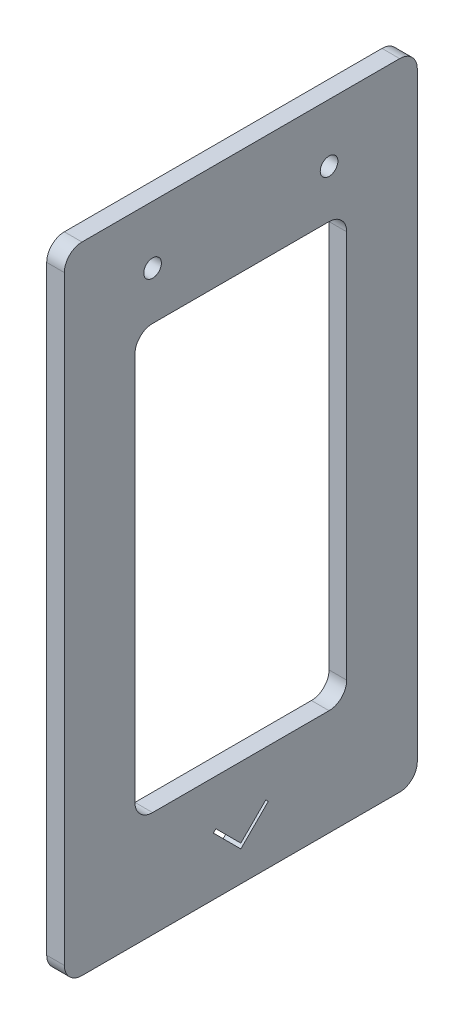
ISO-10303-21;
HEADER;
FILE_DESCRIPTION(('STEP AP214'),'2;1');
FILE_NAME('part.step','',(''),(''),'','','');
FILE_SCHEMA(('AUTOMOTIVE_DESIGN { 1 0 10303 214 1 1 1 1 }'));
ENDSEC;
DATA;
#1=APPLICATION_CONTEXT('core data for automotive mechanical design processes');
#2=APPLICATION_PROTOCOL_DEFINITION('international standard','automotive_design',2000,#1);
#3=PRODUCT_CONTEXT('',#1,'mechanical');
#4=PRODUCT('Part','Part','',(#3));
#5=PRODUCT_RELATED_PRODUCT_CATEGORY('part','',(#4));
#6=PRODUCT_DEFINITION_FORMATION('','',#4);
#7=PRODUCT_DEFINITION_CONTEXT('part definition',#1,'design');
#8=PRODUCT_DEFINITION('design','',#6,#7);
#9=PRODUCT_DEFINITION_SHAPE('','',#8);
#10=(LENGTH_UNIT() NAMED_UNIT(*) SI_UNIT(.MILLI.,.METRE.));
#11=(NAMED_UNIT(*) PLANE_ANGLE_UNIT() SI_UNIT($,.RADIAN.));
#12=(NAMED_UNIT(*) SI_UNIT($,.STERADIAN.) SOLID_ANGLE_UNIT());
#13=UNCERTAINTY_MEASURE_WITH_UNIT(LENGTH_MEASURE(1.E-05),#10,'distance_accuracy_value','');
#14=(GEOMETRIC_REPRESENTATION_CONTEXT(3) GLOBAL_UNCERTAINTY_ASSIGNED_CONTEXT((#13)) GLOBAL_UNIT_ASSIGNED_CONTEXT((#10,
#11,#12)) REPRESENTATION_CONTEXT('',''));
#15=CARTESIAN_POINT('',(0.,0.,0.));
#16=DIRECTION('',(0.,0.,1.));
#17=DIRECTION('',(1.,0.,0.));
#18=AXIS2_PLACEMENT_3D('',#15,#16,#17);
#19=CARTESIAN_POINT('',(6.35,-107.95,57.15));
#20=DIRECTION('',(-1.,0.,0.));
#21=DIRECTION('',(0.,0.,1.));
#22=AXIS2_PLACEMENT_3D('',#19,#20,#21);
#23=PLANE('',#22);
#24=CARTESIAN_POINT('',(6.35,93.472,31.75));
#25=DIRECTION('',(-1.,0.,0.));
#26=DIRECTION('',(0.,0.,1.));
#27=AXIS2_PLACEMENT_3D('',#24,#25,#26);
#28=CIRCLE('',#27,3.175);
#29=CARTESIAN_POINT('',(6.35,93.472,34.925));
#30=VERTEX_POINT('',#29);
#31=EDGE_CURVE('E651',#30,#30,#28,.T.);
#32=ORIENTED_EDGE('',*,*,#31,.T.);
#33=EDGE_LOOP('',(#32));
#34=FACE_BOUND('',#33,.T.);
#35=CARTESIAN_POINT('',(6.35,93.472,-31.75));
#36=DIRECTION('',(-1.,0.,0.));
#37=DIRECTION('',(0.,0.,1.));
#38=AXIS2_PLACEMENT_3D('',#35,#36,#37);
#39=CIRCLE('',#38,3.175);
#40=CARTESIAN_POINT('',(6.35,93.472,-28.575));
#41=VERTEX_POINT('',#40);
#42=EDGE_CURVE('E654',#41,#41,#39,.T.);
#43=ORIENTED_EDGE('',*,*,#42,.T.);
#44=EDGE_LOOP('',(#43));
#45=FACE_BOUND('',#44,.T.);
#46=DIRECTION('',(0.,0.707106781186545,0.70710678118655));
#47=VECTOR('',#46,1.);
#48=CARTESIAN_POINT('',(6.35,-101.6,0.));
#49=LINE('',#48,#47);
#50=CARTESIAN_POINT('',(6.35,-101.6,0.));
#51=VERTEX_POINT('',#50);
#52=CARTESIAN_POINT('',(6.35,-92.6197438789309,8.98025612106918));
#53=VERTEX_POINT('',#52);
#54=EDGE_CURVE('E214',#51,#53,#49,.T.);
#55=ORIENTED_EDGE('',*,*,#54,.F.);
#56=DIRECTION('',(0.,-0.707106781186547,0.707106781186548));
#57=VECTOR('',#56,1.);
#58=CARTESIAN_POINT('',(6.35,-101.6,0.));
#59=LINE('',#58,#57);
#60=CARTESIAN_POINT('',(6.35,-92.6197438789308,-8.98025612106915));
#61=VERTEX_POINT('',#60);
#62=EDGE_CURVE('E55',#61,#51,#59,.T.);
#63=ORIENTED_EDGE('',*,*,#62,.F.);
#64=DIRECTION('',(0.,0.707106781186549,0.707106781186546));
#65=VECTOR('',#64,1.);
#66=CARTESIAN_POINT('',(6.35,-92.6197438789308,-8.98025612106915));
#67=LINE('',#66,#65);
#68=CARTESIAN_POINT('',(6.35,-93.5177694910378,-9.87828173317608));
#69=VERTEX_POINT('',#68);
#70=EDGE_CURVE('E203',#69,#61,#67,.T.);
#71=ORIENTED_EDGE('',*,*,#70,.F.);
#72=DIRECTION('',(0.,0.707106781186549,-0.707106781186546));
#73=VECTOR('',#72,1.);
#74=CARTESIAN_POINT('',(6.35,-103.396051224214,0.));
#75=LINE('',#74,#73);
#76=CARTESIAN_POINT('',(6.35,-103.396051224214,0.));
#77=VERTEX_POINT('',#76);
#78=EDGE_CURVE('E230',#77,#69,#75,.T.);
#79=ORIENTED_EDGE('',*,*,#78,.F.);
#80=DIRECTION('',(0.,-0.707106781186547,-0.707106781186548));
#81=VECTOR('',#80,1.);
#82=CARTESIAN_POINT('',(6.35,-93.5177694910378,9.87828173317609));
#83=LINE('',#82,#81);
#84=CARTESIAN_POINT('',(6.35,-93.5177694910378,9.87828173317609));
#85=VERTEX_POINT('',#84);
#86=EDGE_CURVE('E226',#85,#77,#83,.T.);
#87=ORIENTED_EDGE('',*,*,#86,.F.);
#88=DIRECTION('',(0.,-0.707106781186557,0.707106781186538));
#89=VECTOR('',#88,1.);
#90=CARTESIAN_POINT('',(6.35,-92.6197438789309,8.98025612106918));
#91=LINE('',#90,#89);
#92=EDGE_CURVE('E222',#53,#85,#91,.T.);
#93=ORIENTED_EDGE('',*,*,#92,.F.);
#94=EDGE_LOOP('',(#55,#63,#71,#79,#87,#93));
#95=FACE_BOUND('',#94,.T.);
#96=CARTESIAN_POINT('',(6.35,-107.95,57.15));
#97=DIRECTION('',(1.,0.,0.));
#98=DIRECTION('',(0.,0.,1.));
#99=AXIS2_PLACEMENT_3D('',#96,#97,#98);
#100=CIRCLE('',#99,6.35);
#101=CARTESIAN_POINT('',(6.35,-107.95,63.5));
#102=VERTEX_POINT('',#101);
#103=CARTESIAN_POINT('',(6.35,-114.3,57.15));
#104=VERTEX_POINT('',#103);
#105=EDGE_CURVE('E333',#102,#104,#100,.T.);
#106=ORIENTED_EDGE('',*,*,#105,.T.);
#107=DIRECTION('',(0.,0.,-1.));
#108=VECTOR('',#107,1.);
#109=CARTESIAN_POINT('',(6.35,-114.3,57.15));
#110=LINE('',#109,#108);
#111=CARTESIAN_POINT('',(6.35,-114.3,-57.15));
#112=VERTEX_POINT('',#111);
#113=EDGE_CURVE('E337',#104,#112,#110,.T.);
#114=ORIENTED_EDGE('',*,*,#113,.T.);
#115=CARTESIAN_POINT('',(6.35,-107.95,-57.15));
#116=DIRECTION('',(1.,0.,0.));
#117=DIRECTION('',(0.,0.,1.));
#118=AXIS2_PLACEMENT_3D('',#115,#116,#117);
#119=CIRCLE('',#118,6.35);
#120=CARTESIAN_POINT('',(6.35,-107.95,-63.5));
#121=VERTEX_POINT('',#120);
#122=EDGE_CURVE('E341',#112,#121,#119,.T.);
#123=ORIENTED_EDGE('',*,*,#122,.T.);
#124=DIRECTION('',(0.,1.,0.));
#125=VECTOR('',#124,1.);
#126=CARTESIAN_POINT('',(6.35,-107.95,-63.5));
#127=LINE('',#126,#125);
#128=CARTESIAN_POINT('',(6.35,107.95,-63.5));
#129=VERTEX_POINT('',#128);
#130=EDGE_CURVE('E344',#121,#129,#127,.T.);
#131=ORIENTED_EDGE('',*,*,#130,.T.);
#132=CARTESIAN_POINT('',(6.35,107.95,-57.15));
#133=DIRECTION('',(1.,0.,0.));
#134=DIRECTION('',(0.,0.,-1.));
#135=AXIS2_PLACEMENT_3D('',#132,#133,#134);
#136=CIRCLE('',#135,6.35);
#137=CARTESIAN_POINT('',(6.35,114.3,-57.15));
#138=VERTEX_POINT('',#137);
#139=EDGE_CURVE('E347',#129,#138,#136,.T.);
#140=ORIENTED_EDGE('',*,*,#139,.T.);
#141=DIRECTION('',(0.,0.,1.));
#142=VECTOR('',#141,1.);
#143=CARTESIAN_POINT('',(6.35,114.3,57.15));
#144=LINE('',#143,#142);
#145=CARTESIAN_POINT('',(6.35,114.3,57.15));
#146=VERTEX_POINT('',#145);
#147=EDGE_CURVE('E350',#138,#146,#144,.T.);
#148=ORIENTED_EDGE('',*,*,#147,.T.);
#149=CARTESIAN_POINT('',(6.35,107.95,57.15));
#150=DIRECTION('',(1.,0.,0.));
#151=DIRECTION('',(0.,0.,1.));
#152=AXIS2_PLACEMENT_3D('',#149,#150,#151);
#153=CIRCLE('',#152,6.35);
#154=CARTESIAN_POINT('',(6.35,107.95,63.5));
#155=VERTEX_POINT('',#154);
#156=EDGE_CURVE('E353',#146,#155,#153,.T.);
#157=ORIENTED_EDGE('',*,*,#156,.T.);
#158=DIRECTION('',(0.,-1.,0.));
#159=VECTOR('',#158,1.);
#160=CARTESIAN_POINT('',(6.35,-107.95,63.5));
#161=LINE('',#160,#159);
#162=EDGE_CURVE('E356',#155,#102,#161,.T.);
#163=ORIENTED_EDGE('',*,*,#162,.T.);
#164=EDGE_LOOP('',(#106,#114,#123,#131,#140,#148,#157,#163));
#165=FACE_BOUND('',#164,.T.);
#166=CARTESIAN_POINT('',(6.35,-69.85,-31.75));
#167=DIRECTION('',(1.,0.,0.));
#168=DIRECTION('',(0.,0.,-1.));
#169=AXIS2_PLACEMENT_3D('',#166,#167,#168);
#170=CIRCLE('',#169,6.34999999999999);
#171=CARTESIAN_POINT('',(6.35,-76.2,-31.75));
#172=VERTEX_POINT('',#171);
#173=CARTESIAN_POINT('',(6.35,-69.85,-38.1));
#174=VERTEX_POINT('',#173);
#175=EDGE_CURVE('E250',#172,#174,#170,.T.);
#176=ORIENTED_EDGE('',*,*,#175,.F.);
#177=DIRECTION('',(0.,0.,-1.));
#178=VECTOR('',#177,1.);
#179=CARTESIAN_POINT('',(6.35,-76.2,31.75));
#180=LINE('',#179,#178);
#181=CARTESIAN_POINT('',(6.35,-76.2,31.75));
#182=VERTEX_POINT('',#181);
#183=EDGE_CURVE('E273',#182,#172,#180,.T.);
#184=ORIENTED_EDGE('',*,*,#183,.F.);
#185=CARTESIAN_POINT('',(6.35,-69.85,31.75));
#186=DIRECTION('',(1.,0.,0.));
#187=DIRECTION('',(0.,0.,1.));
#188=AXIS2_PLACEMENT_3D('',#185,#186,#187);
#189=CIRCLE('',#188,6.35);
#190=CARTESIAN_POINT('',(6.35,-69.85,38.1));
#191=VERTEX_POINT('',#190);
#192=EDGE_CURVE('E269',#191,#182,#189,.T.);
#193=ORIENTED_EDGE('',*,*,#192,.F.);
#194=DIRECTION('',(0.,-1.,0.));
#195=VECTOR('',#194,1.);
#196=CARTESIAN_POINT('',(6.35,-69.85,38.1));
#197=LINE('',#196,#195);
#198=CARTESIAN_POINT('',(6.35,69.85,38.1));
#199=VERTEX_POINT('',#198);
#200=EDGE_CURVE('E266',#199,#191,#197,.T.);
#201=ORIENTED_EDGE('',*,*,#200,.F.);
#202=CARTESIAN_POINT('',(6.35,69.85,31.75));
#203=DIRECTION('',(1.,0.,0.));
#204=DIRECTION('',(0.,0.,1.));
#205=AXIS2_PLACEMENT_3D('',#202,#203,#204);
#206=CIRCLE('',#205,6.35);
#207=CARTESIAN_POINT('',(6.35,76.2,31.75));
#208=VERTEX_POINT('',#207);
#209=EDGE_CURVE('E263',#208,#199,#206,.T.);
#210=ORIENTED_EDGE('',*,*,#209,.F.);
#211=DIRECTION('',(0.,0.,1.));
#212=VECTOR('',#211,1.);
#213=CARTESIAN_POINT('',(6.35,76.2,31.75));
#214=LINE('',#213,#212);
#215=CARTESIAN_POINT('',(6.35,76.2,-31.75));
#216=VERTEX_POINT('',#215);
#217=EDGE_CURVE('E260',#216,#208,#214,.T.);
#218=ORIENTED_EDGE('',*,*,#217,.F.);
#219=CARTESIAN_POINT('',(6.35,69.85,-31.75));
#220=DIRECTION('',(1.,0.,0.));
#221=DIRECTION('',(0.,0.,1.));
#222=AXIS2_PLACEMENT_3D('',#219,#220,#221);
#223=CIRCLE('',#222,6.35);
#224=CARTESIAN_POINT('',(6.35,69.85,-38.1));
#225=VERTEX_POINT('',#224);
#226=EDGE_CURVE('E257',#225,#216,#223,.T.);
#227=ORIENTED_EDGE('',*,*,#226,.F.);
#228=DIRECTION('',(0.,1.,0.));
#229=VECTOR('',#228,1.);
#230=CARTESIAN_POINT('',(6.35,-69.85,-38.1));
#231=LINE('',#230,#229);
#232=EDGE_CURVE('E253',#174,#225,#231,.T.);
#233=ORIENTED_EDGE('',*,*,#232,.F.);
#234=EDGE_LOOP('',(#176,#184,#193,#201,#210,#218,#227,#233));
#235=FACE_BOUND('',#234,.T.);
#236=ADVANCED_FACE('F39',(#34,#45,#95,#165,#235),#23,.F.);
#237=CARTESIAN_POINT('',(0.,-107.95,57.15));
#238=DIRECTION('',(-1.,0.,0.));
#239=DIRECTION('',(0.,0.,1.));
#240=AXIS2_PLACEMENT_3D('',#237,#238,#239);
#241=PLANE('',#240);
#242=CARTESIAN_POINT('',(0.,93.472,31.75));
#243=DIRECTION('',(1.,0.,0.));
#244=DIRECTION('',(0.,0.,-1.));
#245=AXIS2_PLACEMENT_3D('',#242,#243,#244);
#246=CIRCLE('',#245,3.175);
#247=CARTESIAN_POINT('',(0.,93.472,28.575));
#248=VERTEX_POINT('',#247);
#249=EDGE_CURVE('E649',#248,#248,#246,.T.);
#250=ORIENTED_EDGE('',*,*,#249,.T.);
#251=EDGE_LOOP('',(#250));
#252=FACE_BOUND('',#251,.T.);
#253=CARTESIAN_POINT('',(0.,93.472,-31.75));
#254=DIRECTION('',(1.,0.,0.));
#255=DIRECTION('',(0.,0.,-1.));
#256=AXIS2_PLACEMENT_3D('',#253,#254,#255);
#257=CIRCLE('',#256,3.175);
#258=CARTESIAN_POINT('',(0.,93.472,-34.925));
#259=VERTEX_POINT('',#258);
#260=EDGE_CURVE('E675',#259,#259,#257,.T.);
#261=ORIENTED_EDGE('',*,*,#260,.T.);
#262=EDGE_LOOP('',(#261));
#263=FACE_BOUND('',#262,.T.);
#264=DIRECTION('',(0.,-0.707106781186547,0.707106781186548));
#265=VECTOR('',#264,1.);
#266=CARTESIAN_POINT('',(0.,-101.6,0.));
#267=LINE('',#266,#265);
#268=CARTESIAN_POINT('',(0.,-92.6197438789308,-8.98025612106915));
#269=VERTEX_POINT('',#268);
#270=CARTESIAN_POINT('',(0.,-101.6,0.));
#271=VERTEX_POINT('',#270);
#272=EDGE_CURVE('E200',#269,#271,#267,.T.);
#273=ORIENTED_EDGE('',*,*,#272,.T.);
#274=DIRECTION('',(0.,0.707106781186545,0.70710678118655));
#275=VECTOR('',#274,1.);
#276=CARTESIAN_POINT('',(0.,-101.6,0.));
#277=LINE('',#276,#275);
#278=CARTESIAN_POINT('',(0.,-92.6197438789309,8.98025612106917));
#279=VERTEX_POINT('',#278);
#280=EDGE_CURVE('E188',#271,#279,#277,.T.);
#281=ORIENTED_EDGE('',*,*,#280,.T.);
#282=DIRECTION('',(0.,-0.707106781186557,0.707106781186538));
#283=VECTOR('',#282,1.);
#284=CARTESIAN_POINT('',(0.,-92.6197438789309,8.98025612106918));
#285=LINE('',#284,#283);
#286=CARTESIAN_POINT('',(0.,-93.5177694910378,9.87828173317609));
#287=VERTEX_POINT('',#286);
#288=EDGE_CURVE('E653',#279,#287,#285,.T.);
#289=ORIENTED_EDGE('',*,*,#288,.T.);
#290=DIRECTION('',(0.,-0.707106781186547,-0.707106781186548));
#291=VECTOR('',#290,1.);
#292=CARTESIAN_POINT('',(0.,-93.5177694910378,9.87828173317609));
#293=LINE('',#292,#291);
#294=CARTESIAN_POINT('',(0.,-103.396051224214,0.));
#295=VERTEX_POINT('',#294);
#296=EDGE_CURVE('E658',#287,#295,#293,.T.);
#297=ORIENTED_EDGE('',*,*,#296,.T.);
#298=DIRECTION('',(0.,0.707106781186549,-0.707106781186546));
#299=VECTOR('',#298,1.);
#300=CARTESIAN_POINT('',(0.,-103.396051224214,0.));
#301=LINE('',#300,#299);
#302=CARTESIAN_POINT('',(0.,-93.5177694910378,-9.87828173317608));
#303=VERTEX_POINT('',#302);
#304=EDGE_CURVE('E216',#295,#303,#301,.T.);
#305=ORIENTED_EDGE('',*,*,#304,.T.);
#306=DIRECTION('',(0.,0.707106781186549,0.707106781186546));
#307=VECTOR('',#306,1.);
#308=CARTESIAN_POINT('',(0.,-92.6197438789308,-8.98025612106915));
#309=LINE('',#308,#307);
#310=EDGE_CURVE('E209',#303,#269,#309,.T.);
#311=ORIENTED_EDGE('',*,*,#310,.T.);
#312=EDGE_LOOP('',(#273,#281,#289,#297,#305,#311));
#313=FACE_BOUND('',#312,.T.);
#314=CARTESIAN_POINT('',(0.,-107.95,57.15));
#315=DIRECTION('',(1.,0.,0.));
#316=DIRECTION('',(0.,0.,1.));
#317=AXIS2_PLACEMENT_3D('',#314,#315,#316);
#318=CIRCLE('',#317,6.35);
#319=CARTESIAN_POINT('',(0.,-107.95,63.5));
#320=VERTEX_POINT('',#319);
#321=CARTESIAN_POINT('',(0.,-114.3,57.15));
#322=VERTEX_POINT('',#321);
#323=EDGE_CURVE('E332',#320,#322,#318,.T.);
#324=ORIENTED_EDGE('',*,*,#323,.F.);
#325=DIRECTION('',(0.,-1.,0.));
#326=VECTOR('',#325,1.);
#327=CARTESIAN_POINT('',(0.,-107.95,63.5));
#328=LINE('',#327,#326);
#329=CARTESIAN_POINT('',(0.,107.95,63.5));
#330=VERTEX_POINT('',#329);
#331=EDGE_CURVE('E338',#330,#320,#328,.T.);
#332=ORIENTED_EDGE('',*,*,#331,.F.);
#333=CARTESIAN_POINT('',(0.,107.95,57.15));
#334=DIRECTION('',(1.,0.,0.));
#335=DIRECTION('',(0.,0.,1.));
#336=AXIS2_PLACEMENT_3D('',#333,#334,#335);
#337=CIRCLE('',#336,6.35);
#338=CARTESIAN_POINT('',(0.,114.3,57.15));
#339=VERTEX_POINT('',#338);
#340=EDGE_CURVE('E378',#339,#330,#337,.T.);
#341=ORIENTED_EDGE('',*,*,#340,.F.);
#342=DIRECTION('',(0.,0.,1.));
#343=VECTOR('',#342,1.);
#344=CARTESIAN_POINT('',(0.,114.3,57.15));
#345=LINE('',#344,#343);
#346=CARTESIAN_POINT('',(0.,114.3,-57.15));
#347=VERTEX_POINT('',#346);
#348=EDGE_CURVE('E375',#347,#339,#345,.T.);
#349=ORIENTED_EDGE('',*,*,#348,.F.);
#350=CARTESIAN_POINT('',(0.,107.95,-57.15));
#351=DIRECTION('',(1.,0.,0.));
#352=DIRECTION('',(0.,0.,-1.));
#353=AXIS2_PLACEMENT_3D('',#350,#351,#352);
#354=CIRCLE('',#353,6.35);
#355=CARTESIAN_POINT('',(0.,107.95,-63.5));
#356=VERTEX_POINT('',#355);
#357=EDGE_CURVE('E372',#356,#347,#354,.T.);
#358=ORIENTED_EDGE('',*,*,#357,.F.);
#359=DIRECTION('',(0.,1.,0.));
#360=VECTOR('',#359,1.);
#361=CARTESIAN_POINT('',(0.,-107.95,-63.5));
#362=LINE('',#361,#360);
#363=CARTESIAN_POINT('',(0.,-107.95,-63.5));
#364=VERTEX_POINT('',#363);
#365=EDGE_CURVE('E369',#364,#356,#362,.T.);
#366=ORIENTED_EDGE('',*,*,#365,.F.);
#367=CARTESIAN_POINT('',(0.,-107.95,-57.15));
#368=DIRECTION('',(1.,0.,0.));
#369=DIRECTION('',(0.,0.,1.));
#370=AXIS2_PLACEMENT_3D('',#367,#368,#369);
#371=CIRCLE('',#370,6.35);
#372=CARTESIAN_POINT('',(0.,-114.3,-57.15));
#373=VERTEX_POINT('',#372);
#374=EDGE_CURVE('E366',#373,#364,#371,.T.);
#375=ORIENTED_EDGE('',*,*,#374,.F.);
#376=DIRECTION('',(0.,0.,-1.));
#377=VECTOR('',#376,1.);
#378=CARTESIAN_POINT('',(0.,-114.3,57.15));
#379=LINE('',#378,#377);
#380=EDGE_CURVE('E363',#322,#373,#379,.T.);
#381=ORIENTED_EDGE('',*,*,#380,.F.);
#382=EDGE_LOOP('',(#324,#332,#341,#349,#358,#366,#375,#381));
#383=FACE_BOUND('',#382,.T.);
#384=DIRECTION('',(0.,0.,-1.));
#385=VECTOR('',#384,1.);
#386=CARTESIAN_POINT('',(0.,-76.2,31.75));
#387=LINE('',#386,#385);
#388=CARTESIAN_POINT('',(0.,-76.2,31.75));
#389=VERTEX_POINT('',#388);
#390=CARTESIAN_POINT('',(0.,-76.2,-31.75));
#391=VERTEX_POINT('',#390);
#392=EDGE_CURVE('E254',#389,#391,#387,.T.);
#393=ORIENTED_EDGE('',*,*,#392,.T.);
#394=CARTESIAN_POINT('',(0.,-69.85,-31.75));
#395=DIRECTION('',(1.,0.,0.));
#396=DIRECTION('',(0.,0.,-1.));
#397=AXIS2_PLACEMENT_3D('',#394,#395,#396);
#398=CIRCLE('',#397,6.34999999999999);
#399=CARTESIAN_POINT('',(0.,-69.85,-38.1));
#400=VERTEX_POINT('',#399);
#401=EDGE_CURVE('E196',#391,#400,#398,.T.);
#402=ORIENTED_EDGE('',*,*,#401,.T.);
#403=DIRECTION('',(0.,1.,0.));
#404=VECTOR('',#403,1.);
#405=CARTESIAN_POINT('',(0.,-69.85,-38.1));
#406=LINE('',#405,#404);
#407=CARTESIAN_POINT('',(0.,69.85,-38.1));
#408=VERTEX_POINT('',#407);
#409=EDGE_CURVE('E280',#400,#408,#406,.T.);
#410=ORIENTED_EDGE('',*,*,#409,.T.);
#411=CARTESIAN_POINT('',(0.,69.85,-31.75));
#412=DIRECTION('',(1.,0.,0.));
#413=DIRECTION('',(0.,0.,1.));
#414=AXIS2_PLACEMENT_3D('',#411,#412,#413);
#415=CIRCLE('',#414,6.35);
#416=CARTESIAN_POINT('',(0.,76.2,-31.75));
#417=VERTEX_POINT('',#416);
#418=EDGE_CURVE('E284',#408,#417,#415,.T.);
#419=ORIENTED_EDGE('',*,*,#418,.T.);
#420=DIRECTION('',(0.,0.,1.));
#421=VECTOR('',#420,1.);
#422=CARTESIAN_POINT('',(0.,76.2,31.75));
#423=LINE('',#422,#421);
#424=CARTESIAN_POINT('',(0.,76.2,31.75));
#425=VERTEX_POINT('',#424);
#426=EDGE_CURVE('E288',#417,#425,#423,.T.);
#427=ORIENTED_EDGE('',*,*,#426,.T.);
#428=CARTESIAN_POINT('',(0.,69.85,31.75));
#429=DIRECTION('',(1.,0.,0.));
#430=DIRECTION('',(0.,0.,1.));
#431=AXIS2_PLACEMENT_3D('',#428,#429,#430);
#432=CIRCLE('',#431,6.35);
#433=CARTESIAN_POINT('',(0.,69.85,38.1));
#434=VERTEX_POINT('',#433);
#435=EDGE_CURVE('E292',#425,#434,#432,.T.);
#436=ORIENTED_EDGE('',*,*,#435,.T.);
#437=DIRECTION('',(0.,-1.,0.));
#438=VECTOR('',#437,1.);
#439=CARTESIAN_POINT('',(0.,-69.85,38.1));
#440=LINE('',#439,#438);
#441=CARTESIAN_POINT('',(0.,-69.85,38.1));
#442=VERTEX_POINT('',#441);
#443=EDGE_CURVE('E296',#434,#442,#440,.T.);
#444=ORIENTED_EDGE('',*,*,#443,.T.);
#445=CARTESIAN_POINT('',(0.,-69.85,31.75));
#446=DIRECTION('',(1.,0.,0.));
#447=DIRECTION('',(0.,0.,1.));
#448=AXIS2_PLACEMENT_3D('',#445,#446,#447);
#449=CIRCLE('',#448,6.35);
#450=EDGE_CURVE('E300',#442,#389,#449,.T.);
#451=ORIENTED_EDGE('',*,*,#450,.T.);
#452=EDGE_LOOP('',(#393,#402,#410,#419,#427,#436,#444,#451));
#453=FACE_BOUND('',#452,.T.);
#454=ADVANCED_FACE('F206',(#252,#263,#313,#383,#453),#241,.T.);
#455=CARTESIAN_POINT('',(6.35,-107.95,57.15));
#456=DIRECTION('',(-1.,0.,0.));
#457=DIRECTION('',(0.,0.,1.));
#458=AXIS2_PLACEMENT_3D('',#455,#456,#457);
#459=CYLINDRICAL_SURFACE('',#458,6.35);
#460=ORIENTED_EDGE('',*,*,#323,.T.);
#461=DIRECTION('',(-1.,0.,0.));
#462=VECTOR('',#461,1.);
#463=CARTESIAN_POINT('',(6.35,-114.3,57.15));
#464=LINE('',#463,#462);
#465=EDGE_CURVE('E11',#104,#322,#464,.T.);
#466=ORIENTED_EDGE('',*,*,#465,.F.);
#467=ORIENTED_EDGE('',*,*,#105,.F.);
#468=DIRECTION('',(-1.,0.,0.));
#469=VECTOR('',#468,1.);
#470=CARTESIAN_POINT('',(6.35,-107.95,63.5));
#471=LINE('',#470,#469);
#472=EDGE_CURVE('E359',#102,#320,#471,.T.);
#473=ORIENTED_EDGE('',*,*,#472,.T.);
#474=EDGE_LOOP('',(#460,#466,#467,#473));
#475=FACE_BOUND('',#474,.T.);
#476=ADVANCED_FACE('F41',(#475),#459,.T.);
#477=CARTESIAN_POINT('',(6.35,-114.3,57.15));
#478=DIRECTION('',(0.,1.,0.));
#479=DIRECTION('',(0.,0.,1.));
#480=AXIS2_PLACEMENT_3D('',#477,#478,#479);
#481=PLANE('',#480);
#482=ORIENTED_EDGE('',*,*,#380,.T.);
#483=DIRECTION('',(-1.,0.,0.));
#484=VECTOR('',#483,1.);
#485=CARTESIAN_POINT('',(6.35,-114.3,-57.15));
#486=LINE('',#485,#484);
#487=EDGE_CURVE('E48',#112,#373,#486,.T.);
#488=ORIENTED_EDGE('',*,*,#487,.F.);
#489=ORIENTED_EDGE('',*,*,#113,.F.);
#490=ORIENTED_EDGE('',*,*,#465,.T.);
#491=EDGE_LOOP('',(#482,#488,#489,#490));
#492=FACE_BOUND('',#491,.T.);
#493=ADVANCED_FACE('F433',(#492),#481,.F.);
#494=CARTESIAN_POINT('',(6.35,-107.95,-57.15));
#495=DIRECTION('',(-1.,0.,0.));
#496=DIRECTION('',(0.,0.,1.));
#497=AXIS2_PLACEMENT_3D('',#494,#495,#496);
#498=CYLINDRICAL_SURFACE('',#497,6.35);
#499=ORIENTED_EDGE('',*,*,#374,.T.);
#500=DIRECTION('',(-1.,0.,0.));
#501=VECTOR('',#500,1.);
#502=CARTESIAN_POINT('',(6.35,-107.95,-63.5));
#503=LINE('',#502,#501);
#504=EDGE_CURVE('E402',#121,#364,#503,.T.);
#505=ORIENTED_EDGE('',*,*,#504,.F.);
#506=ORIENTED_EDGE('',*,*,#122,.F.);
#507=ORIENTED_EDGE('',*,*,#487,.T.);
#508=EDGE_LOOP('',(#499,#505,#506,#507));
#509=FACE_BOUND('',#508,.T.);
#510=ADVANCED_FACE('F411',(#509),#498,.T.);
#511=CARTESIAN_POINT('',(6.35,-107.95,-63.5));
#512=DIRECTION('',(0.,0.,1.));
#513=DIRECTION('',(1.,0.,0.));
#514=AXIS2_PLACEMENT_3D('',#511,#512,#513);
#515=PLANE('',#514);
#516=ORIENTED_EDGE('',*,*,#365,.T.);
#517=DIRECTION('',(-1.,0.,0.));
#518=VECTOR('',#517,1.);
#519=CARTESIAN_POINT('',(6.35,107.95,-63.5));
#520=LINE('',#519,#518);
#521=EDGE_CURVE('E398',#129,#356,#520,.T.);
#522=ORIENTED_EDGE('',*,*,#521,.F.);
#523=ORIENTED_EDGE('',*,*,#130,.F.);
#524=ORIENTED_EDGE('',*,*,#504,.T.);
#525=EDGE_LOOP('',(#516,#522,#523,#524));
#526=FACE_BOUND('',#525,.T.);
#527=ADVANCED_FACE('F421',(#526),#515,.F.);
#528=CARTESIAN_POINT('',(6.35,107.95,-57.15));
#529=DIRECTION('',(-1.,0.,0.));
#530=DIRECTION('',(0.,0.,1.));
#531=AXIS2_PLACEMENT_3D('',#528,#529,#530);
#532=CYLINDRICAL_SURFACE('',#531,6.35);
#533=ORIENTED_EDGE('',*,*,#357,.T.);
#534=DIRECTION('',(-1.,0.,0.));
#535=VECTOR('',#534,1.);
#536=CARTESIAN_POINT('',(6.35,114.3,-57.15));
#537=LINE('',#536,#535);
#538=EDGE_CURVE('E394',#138,#347,#537,.T.);
#539=ORIENTED_EDGE('',*,*,#538,.F.);
#540=ORIENTED_EDGE('',*,*,#139,.F.);
#541=ORIENTED_EDGE('',*,*,#521,.T.);
#542=EDGE_LOOP('',(#533,#539,#540,#541));
#543=FACE_BOUND('',#542,.T.);
#544=ADVANCED_FACE('F425',(#543),#532,.T.);
#545=CARTESIAN_POINT('',(6.35,114.3,57.15));
#546=DIRECTION('',(0.,-1.,0.));
#547=DIRECTION('',(0.,0.,-1.));
#548=AXIS2_PLACEMENT_3D('',#545,#546,#547);
#549=PLANE('',#548);
#550=ORIENTED_EDGE('',*,*,#348,.T.);
#551=DIRECTION('',(-1.,0.,0.));
#552=VECTOR('',#551,1.);
#553=CARTESIAN_POINT('',(6.35,114.3,57.15));
#554=LINE('',#553,#552);
#555=EDGE_CURVE('E390',#146,#339,#554,.T.);
#556=ORIENTED_EDGE('',*,*,#555,.F.);
#557=ORIENTED_EDGE('',*,*,#147,.F.);
#558=ORIENTED_EDGE('',*,*,#538,.T.);
#559=EDGE_LOOP('',(#550,#556,#557,#558));
#560=FACE_BOUND('',#559,.T.);
#561=ADVANCED_FACE('F446',(#560),#549,.F.);
#562=CARTESIAN_POINT('',(6.35,107.95,57.15));
#563=DIRECTION('',(-1.,0.,0.));
#564=DIRECTION('',(0.,0.,1.));
#565=AXIS2_PLACEMENT_3D('',#562,#563,#564);
#566=CYLINDRICAL_SURFACE('',#565,6.35);
#567=ORIENTED_EDGE('',*,*,#340,.T.);
#568=DIRECTION('',(-1.,0.,0.));
#569=VECTOR('',#568,1.);
#570=CARTESIAN_POINT('',(6.35,107.95,63.5));
#571=LINE('',#570,#569);
#572=EDGE_CURVE('E386',#155,#330,#571,.T.);
#573=ORIENTED_EDGE('',*,*,#572,.F.);
#574=ORIENTED_EDGE('',*,*,#156,.F.);
#575=ORIENTED_EDGE('',*,*,#555,.T.);
#576=EDGE_LOOP('',(#567,#573,#574,#575));
#577=FACE_BOUND('',#576,.T.);
#578=ADVANCED_FACE('F444',(#577),#566,.T.);
#579=CARTESIAN_POINT('',(6.35,-107.95,63.5));
#580=DIRECTION('',(0.,0.,-1.));
#581=DIRECTION('',(-1.,0.,0.));
#582=AXIS2_PLACEMENT_3D('',#579,#580,#581);
#583=PLANE('',#582);
#584=ORIENTED_EDGE('',*,*,#331,.T.);
#585=ORIENTED_EDGE('',*,*,#472,.F.);
#586=ORIENTED_EDGE('',*,*,#162,.F.);
#587=ORIENTED_EDGE('',*,*,#572,.T.);
#588=EDGE_LOOP('',(#584,#585,#586,#587));
#589=FACE_BOUND('',#588,.T.);
#590=ADVANCED_FACE('F439',(#589),#583,.F.);
#591=CARTESIAN_POINT('',(6.35,-69.85,-31.75));
#592=DIRECTION('',(-1.,0.,0.));
#593=DIRECTION('',(0.,0.,1.));
#594=AXIS2_PLACEMENT_3D('',#591,#592,#593);
#595=CYLINDRICAL_SURFACE('',#594,6.34999999999999);
#596=ORIENTED_EDGE('',*,*,#401,.F.);
#597=DIRECTION('',(-1.,0.,0.));
#598=VECTOR('',#597,1.);
#599=CARTESIAN_POINT('',(6.35,-76.2,-31.75));
#600=LINE('',#599,#598);
#601=EDGE_CURVE('E276',#172,#391,#600,.T.);
#602=ORIENTED_EDGE('',*,*,#601,.F.);
#603=ORIENTED_EDGE('',*,*,#175,.T.);
#604=DIRECTION('',(-1.,0.,0.));
#605=VECTOR('',#604,1.);
#606=CARTESIAN_POINT('',(6.35,-69.85,-38.1));
#607=LINE('',#606,#605);
#608=EDGE_CURVE('E328',#174,#400,#607,.T.);
#609=ORIENTED_EDGE('',*,*,#608,.T.);
#610=EDGE_LOOP('',(#596,#602,#603,#609));
#611=FACE_BOUND('',#610,.T.);
#612=ADVANCED_FACE('F466',(#611),#595,.F.);
#613=CARTESIAN_POINT('',(6.35,-69.85,-38.1));
#614=DIRECTION('',(0.,0.,1.));
#615=DIRECTION('',(0.,-1.,0.));
#616=AXIS2_PLACEMENT_3D('',#613,#614,#615);
#617=PLANE('',#616);
#618=ORIENTED_EDGE('',*,*,#409,.F.);
#619=ORIENTED_EDGE('',*,*,#608,.F.);
#620=ORIENTED_EDGE('',*,*,#232,.T.);
#621=DIRECTION('',(-1.,0.,0.));
#622=VECTOR('',#621,1.);
#623=CARTESIAN_POINT('',(6.35,69.85,-38.1));
#624=LINE('',#623,#622);
#625=EDGE_CURVE('E325',#225,#408,#624,.T.);
#626=ORIENTED_EDGE('',*,*,#625,.T.);
#627=EDGE_LOOP('',(#618,#619,#620,#626));
#628=FACE_BOUND('',#627,.T.);
#629=ADVANCED_FACE('F473',(#628),#617,.T.);
#630=CARTESIAN_POINT('',(6.35,69.85,-31.75));
#631=DIRECTION('',(-1.,0.,0.));
#632=DIRECTION('',(0.,0.,1.));
#633=AXIS2_PLACEMENT_3D('',#630,#631,#632);
#634=CYLINDRICAL_SURFACE('',#633,6.35);
#635=ORIENTED_EDGE('',*,*,#418,.F.);
#636=ORIENTED_EDGE('',*,*,#625,.F.);
#637=ORIENTED_EDGE('',*,*,#226,.T.);
#638=DIRECTION('',(-1.,0.,0.));
#639=VECTOR('',#638,1.);
#640=CARTESIAN_POINT('',(6.35,76.2,-31.75));
#641=LINE('',#640,#639);
#642=EDGE_CURVE('E322',#216,#417,#641,.T.);
#643=ORIENTED_EDGE('',*,*,#642,.T.);
#644=EDGE_LOOP('',(#635,#636,#637,#643));
#645=FACE_BOUND('',#644,.T.);
#646=ADVANCED_FACE('F478',(#645),#634,.F.);
#647=CARTESIAN_POINT('',(6.35,76.2,31.75));
#648=DIRECTION('',(0.,-1.,0.));
#649=DIRECTION('',(0.,0.,-1.));
#650=AXIS2_PLACEMENT_3D('',#647,#648,#649);
#651=PLANE('',#650);
#652=ORIENTED_EDGE('',*,*,#426,.F.);
#653=ORIENTED_EDGE('',*,*,#642,.F.);
#654=ORIENTED_EDGE('',*,*,#217,.T.);
#655=DIRECTION('',(-1.,0.,0.));
#656=VECTOR('',#655,1.);
#657=CARTESIAN_POINT('',(6.35,76.2,31.75));
#658=LINE('',#657,#656);
#659=EDGE_CURVE('E319',#208,#425,#658,.T.);
#660=ORIENTED_EDGE('',*,*,#659,.T.);
#661=EDGE_LOOP('',(#652,#653,#654,#660));
#662=FACE_BOUND('',#661,.T.);
#663=ADVANCED_FACE('F503',(#662),#651,.T.);
#664=CARTESIAN_POINT('',(6.35,69.85,31.75));
#665=DIRECTION('',(-1.,0.,0.));
#666=DIRECTION('',(0.,0.,1.));
#667=AXIS2_PLACEMENT_3D('',#664,#665,#666);
#668=CYLINDRICAL_SURFACE('',#667,6.35);
#669=ORIENTED_EDGE('',*,*,#435,.F.);
#670=ORIENTED_EDGE('',*,*,#659,.F.);
#671=ORIENTED_EDGE('',*,*,#209,.T.);
#672=DIRECTION('',(-1.,0.,0.));
#673=VECTOR('',#672,1.);
#674=CARTESIAN_POINT('',(6.35,69.85,38.1));
#675=LINE('',#674,#673);
#676=EDGE_CURVE('E316',#199,#434,#675,.T.);
#677=ORIENTED_EDGE('',*,*,#676,.T.);
#678=EDGE_LOOP('',(#669,#670,#671,#677));
#679=FACE_BOUND('',#678,.T.);
#680=ADVANCED_FACE('F508',(#679),#668,.F.);
#681=CARTESIAN_POINT('',(6.35,-69.85,38.1));
#682=DIRECTION('',(0.,0.,-1.));
#683=DIRECTION('',(-1.,0.,0.));
#684=AXIS2_PLACEMENT_3D('',#681,#682,#683);
#685=PLANE('',#684);
#686=ORIENTED_EDGE('',*,*,#443,.F.);
#687=ORIENTED_EDGE('',*,*,#676,.F.);
#688=ORIENTED_EDGE('',*,*,#200,.T.);
#689=DIRECTION('',(-1.,0.,0.));
#690=VECTOR('',#689,1.);
#691=CARTESIAN_POINT('',(6.35,-69.85,38.1));
#692=LINE('',#691,#690);
#693=EDGE_CURVE('E313',#191,#442,#692,.T.);
#694=ORIENTED_EDGE('',*,*,#693,.T.);
#695=EDGE_LOOP('',(#686,#687,#688,#694));
#696=FACE_BOUND('',#695,.T.);
#697=ADVANCED_FACE('F511',(#696),#685,.T.);
#698=CARTESIAN_POINT('',(6.35,-69.85,31.75));
#699=DIRECTION('',(-1.,0.,0.));
#700=DIRECTION('',(0.,0.,1.));
#701=AXIS2_PLACEMENT_3D('',#698,#699,#700);
#702=CYLINDRICAL_SURFACE('',#701,6.35);
#703=ORIENTED_EDGE('',*,*,#450,.F.);
#704=ORIENTED_EDGE('',*,*,#693,.F.);
#705=ORIENTED_EDGE('',*,*,#192,.T.);
#706=DIRECTION('',(-1.,0.,0.));
#707=VECTOR('',#706,1.);
#708=CARTESIAN_POINT('',(6.35,-76.2,31.75));
#709=LINE('',#708,#707);
#710=EDGE_CURVE('E310',#182,#389,#709,.T.);
#711=ORIENTED_EDGE('',*,*,#710,.T.);
#712=EDGE_LOOP('',(#703,#704,#705,#711));
#713=FACE_BOUND('',#712,.T.);
#714=ADVANCED_FACE('F491',(#713),#702,.F.);
#715=CARTESIAN_POINT('',(6.35,-76.2,31.75));
#716=DIRECTION('',(0.,1.,0.));
#717=DIRECTION('',(0.,0.,1.));
#718=AXIS2_PLACEMENT_3D('',#715,#716,#717);
#719=PLANE('',#718);
#720=ORIENTED_EDGE('',*,*,#392,.F.);
#721=ORIENTED_EDGE('',*,*,#710,.F.);
#722=ORIENTED_EDGE('',*,*,#183,.T.);
#723=ORIENTED_EDGE('',*,*,#601,.T.);
#724=EDGE_LOOP('',(#720,#721,#722,#723));
#725=FACE_BOUND('',#724,.T.);
#726=ADVANCED_FACE('F485',(#725),#719,.T.);
#727=CARTESIAN_POINT('',(-0.00100000000000013,-101.6,0.));
#728=DIRECTION('',(0.,0.707106781186548,0.707106781186548));
#729=DIRECTION('',(0.,-0.707106781186547,0.707106781186548));
#730=AXIS2_PLACEMENT_3D('',#727,#728,#729);
#731=PLANE('',#730);
#732=DIRECTION('',(1.,0.,0.));
#733=VECTOR('',#732,1.);
#734=CARTESIAN_POINT('',(-0.00100000000000013,-92.6197438789308,-8.98025612106915));
#735=LINE('',#734,#733);
#736=EDGE_CURVE('E197',#269,#61,#735,.T.);
#737=ORIENTED_EDGE('',*,*,#736,.T.);
#738=ORIENTED_EDGE('',*,*,#62,.T.);
#739=DIRECTION('',(1.,0.,0.));
#740=VECTOR('',#739,1.);
#741=CARTESIAN_POINT('',(-0.00100000000000013,-101.6,0.));
#742=LINE('',#741,#740);
#743=EDGE_CURVE('E190',#271,#51,#742,.T.);
#744=ORIENTED_EDGE('',*,*,#743,.F.);
#745=ORIENTED_EDGE('',*,*,#272,.F.);
#746=EDGE_LOOP('',(#737,#738,#744,#745));
#747=FACE_BOUND('',#746,.T.);
#748=ADVANCED_FACE('F199',(#747),#731,.F.);
#749=CARTESIAN_POINT('',(-0.00100000000000013,-92.6197438789308,-8.98025612106915));
#750=DIRECTION('',(0.,0.707106781186546,-0.707106781186549));
#751=DIRECTION('',(0.,0.707106781186549,0.707106781186546));
#752=AXIS2_PLACEMENT_3D('',#749,#750,#751);
#753=PLANE('',#752);
#754=DIRECTION('',(1.,0.,0.));
#755=VECTOR('',#754,1.);
#756=CARTESIAN_POINT('',(-0.00100000000000013,-93.5177694910378,-9.87828173317608));
#757=LINE('',#756,#755);
#758=EDGE_CURVE('E239',#303,#69,#757,.T.);
#759=ORIENTED_EDGE('',*,*,#758,.T.);
#760=ORIENTED_EDGE('',*,*,#70,.T.);
#761=ORIENTED_EDGE('',*,*,#736,.F.);
#762=ORIENTED_EDGE('',*,*,#310,.F.);
#763=EDGE_LOOP('',(#759,#760,#761,#762));
#764=FACE_BOUND('',#763,.T.);
#765=ADVANCED_FACE('F563',(#764),#753,.F.);
#766=CARTESIAN_POINT('',(-0.00100000000000013,-103.396051224214,0.));
#767=DIRECTION('',(0.,-0.707106781186546,-0.707106781186549));
#768=DIRECTION('',(0.,0.707106781186549,-0.707106781186546));
#769=AXIS2_PLACEMENT_3D('',#766,#767,#768);
#770=PLANE('',#769);
#771=DIRECTION('',(1.,0.,0.));
#772=VECTOR('',#771,1.);
#773=CARTESIAN_POINT('',(-0.00100000000000013,-103.396051224214,0.));
#774=LINE('',#773,#772);
#775=EDGE_CURVE('E242',#295,#77,#774,.T.);
#776=ORIENTED_EDGE('',*,*,#775,.T.);
#777=ORIENTED_EDGE('',*,*,#78,.T.);
#778=ORIENTED_EDGE('',*,*,#758,.F.);
#779=ORIENTED_EDGE('',*,*,#304,.F.);
#780=EDGE_LOOP('',(#776,#777,#778,#779));
#781=FACE_BOUND('',#780,.T.);
#782=ADVANCED_FACE('F572',(#781),#770,.F.);
#783=CARTESIAN_POINT('',(-0.00100000000000013,-93.5177694910378,9.87828173317609));
#784=DIRECTION('',(0.,-0.707106781186548,0.707106781186547));
#785=DIRECTION('',(0.,-0.707106781186547,-0.707106781186548));
#786=AXIS2_PLACEMENT_3D('',#783,#784,#785);
#787=PLANE('',#786);
#788=DIRECTION('',(1.,0.,0.));
#789=VECTOR('',#788,1.);
#790=CARTESIAN_POINT('',(-0.00100000000000013,-93.5177694910378,9.87828173317609));
#791=LINE('',#790,#789);
#792=EDGE_CURVE('E245',#287,#85,#791,.T.);
#793=ORIENTED_EDGE('',*,*,#792,.T.);
#794=ORIENTED_EDGE('',*,*,#86,.T.);
#795=ORIENTED_EDGE('',*,*,#775,.F.);
#796=ORIENTED_EDGE('',*,*,#296,.F.);
#797=EDGE_LOOP('',(#793,#794,#795,#796));
#798=FACE_BOUND('',#797,.T.);
#799=ADVANCED_FACE('F582',(#798),#787,.F.);
#800=CARTESIAN_POINT('',(-0.00100000000000013,-92.6197438789309,8.98025612106918));
#801=DIRECTION('',(0.,0.707106781186538,0.707106781186557));
#802=DIRECTION('',(0.,-0.707106781186557,0.707106781186538));
#803=AXIS2_PLACEMENT_3D('',#800,#801,#802);
#804=PLANE('',#803);
#805=DIRECTION('',(1.,0.,0.));
#806=VECTOR('',#805,1.);
#807=CARTESIAN_POINT('',(-0.00100000000000013,-92.6197438789309,8.98025612106918));
#808=LINE('',#807,#806);
#809=EDGE_CURVE('E63',#279,#53,#808,.T.);
#810=ORIENTED_EDGE('',*,*,#809,.T.);
#811=ORIENTED_EDGE('',*,*,#92,.T.);
#812=ORIENTED_EDGE('',*,*,#792,.F.);
#813=ORIENTED_EDGE('',*,*,#288,.F.);
#814=EDGE_LOOP('',(#810,#811,#812,#813));
#815=FACE_BOUND('',#814,.T.);
#816=ADVANCED_FACE('F592',(#815),#804,.F.);
#817=CARTESIAN_POINT('',(-0.00100000000000013,-101.6,0.));
#818=DIRECTION('',(0.,0.70710678118655,-0.707106781186545));
#819=DIRECTION('',(0.,0.707106781186545,0.70710678118655));
#820=AXIS2_PLACEMENT_3D('',#817,#818,#819);
#821=PLANE('',#820);
#822=ORIENTED_EDGE('',*,*,#743,.T.);
#823=ORIENTED_EDGE('',*,*,#54,.T.);
#824=ORIENTED_EDGE('',*,*,#809,.F.);
#825=ORIENTED_EDGE('',*,*,#280,.F.);
#826=EDGE_LOOP('',(#822,#823,#824,#825));
#827=FACE_BOUND('',#826,.T.);
#828=ADVANCED_FACE('F189',(#827),#821,.F.);
#829=CARTESIAN_POINT('',(0.,93.472,-31.75));
#830=DIRECTION('',(1.,0.,0.));
#831=DIRECTION('',(0.,0.,-1.));
#832=AXIS2_PLACEMENT_3D('',#829,#830,#831);
#833=CYLINDRICAL_SURFACE('',#832,3.175);
#834=ORIENTED_EDGE('',*,*,#260,.F.);
#835=EDGE_LOOP('',(#834));
#836=FACE_BOUND('',#835,.T.);
#837=ORIENTED_EDGE('',*,*,#42,.F.);
#838=EDGE_LOOP('',(#837));
#839=FACE_BOUND('',#838,.T.);
#840=ADVANCED_FACE('F610',(#836,#839),#833,.F.);
#841=CARTESIAN_POINT('',(0.,93.472,31.75));
#842=DIRECTION('',(1.,0.,0.));
#843=DIRECTION('',(0.,0.,-1.));
#844=AXIS2_PLACEMENT_3D('',#841,#842,#843);
#845=CYLINDRICAL_SURFACE('',#844,3.175);
#846=ORIENTED_EDGE('',*,*,#249,.F.);
#847=EDGE_LOOP('',(#846));
#848=FACE_BOUND('',#847,.T.);
#849=ORIENTED_EDGE('',*,*,#31,.F.);
#850=EDGE_LOOP('',(#849));
#851=FACE_BOUND('',#850,.T.);
#852=ADVANCED_FACE('F632',(#848,#851),#845,.F.);
#853=CLOSED_SHELL('',(#236,#454,#476,#493,#510,#527,#544,#561,#578,#590,#612,#629,#646,#663,
#680,#697,#714,#726,#748,#765,#782,#799,#816,#828,#840,#852));
#854=MANIFOLD_SOLID_BREP('B2',#853);
#855=ADVANCED_BREP_SHAPE_REPRESENTATION('',(#18,#854),#14);
#856=SHAPE_DEFINITION_REPRESENTATION(#9,#855);
ENDSEC;
END-ISO-10303-21;
